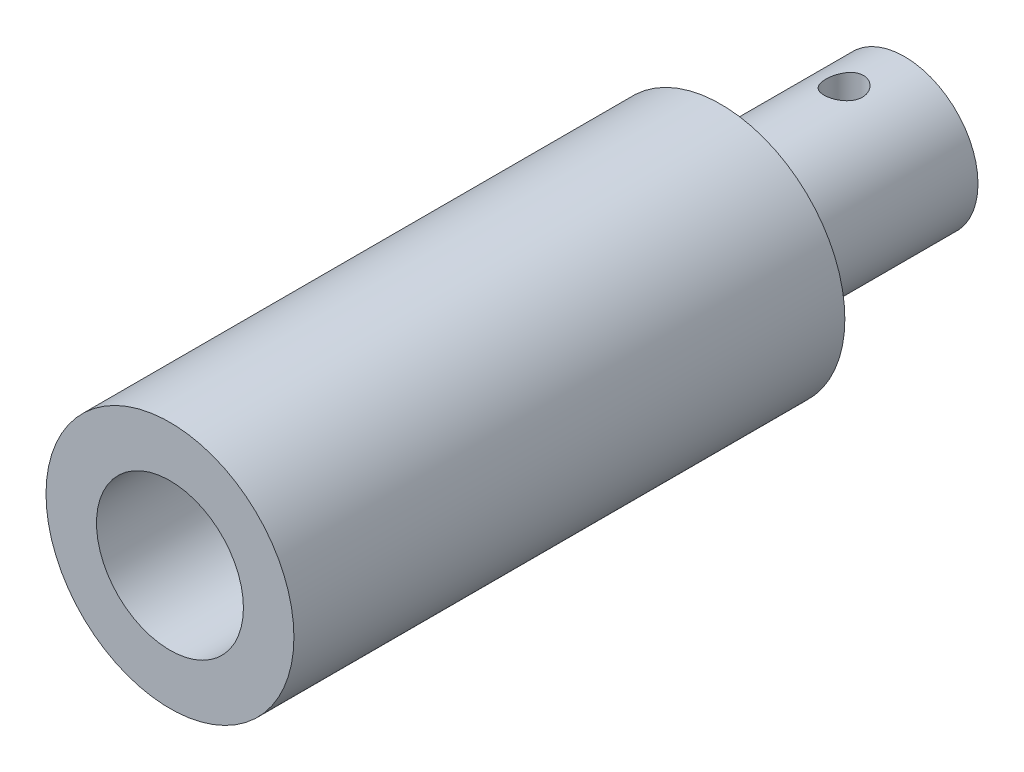
ISO-10303-21;
HEADER;
FILE_DESCRIPTION(('STEP AP214'),'2;1');
FILE_NAME('part.step','',(''),(''),'','','');
FILE_SCHEMA(('AUTOMOTIVE_DESIGN { 1 0 10303 214 1 1 1 1 }'));
ENDSEC;
DATA;
#1=APPLICATION_CONTEXT('core data for automotive mechanical design processes');
#2=APPLICATION_PROTOCOL_DEFINITION('international standard','automotive_design',2000,#1);
#3=PRODUCT_CONTEXT('',#1,'mechanical');
#4=PRODUCT('Part','Part','',(#3));
#5=PRODUCT_RELATED_PRODUCT_CATEGORY('part','',(#4));
#6=PRODUCT_DEFINITION_FORMATION('','',#4);
#7=PRODUCT_DEFINITION_CONTEXT('part definition',#1,'design');
#8=PRODUCT_DEFINITION('design','',#6,#7);
#9=PRODUCT_DEFINITION_SHAPE('','',#8);
#10=(LENGTH_UNIT() NAMED_UNIT(*) SI_UNIT(.MILLI.,.METRE.));
#11=(NAMED_UNIT(*) PLANE_ANGLE_UNIT() SI_UNIT($,.RADIAN.));
#12=(NAMED_UNIT(*) SI_UNIT($,.STERADIAN.) SOLID_ANGLE_UNIT());
#13=UNCERTAINTY_MEASURE_WITH_UNIT(LENGTH_MEASURE(1.E-05),#10,'distance_accuracy_value','');
#14=(GEOMETRIC_REPRESENTATION_CONTEXT(3) GLOBAL_UNCERTAINTY_ASSIGNED_CONTEXT((#13)) GLOBAL_UNIT_ASSIGNED_CONTEXT((#10,
#11,#12)) REPRESENTATION_CONTEXT('',''));
#15=CARTESIAN_POINT('',(0.,0.,0.));
#16=DIRECTION('',(0.,0.,1.));
#17=DIRECTION('',(1.,0.,0.));
#18=AXIS2_PLACEMENT_3D('',#15,#16,#17);
#19=CARTESIAN_POINT('',(0.,0.,30.));
#20=DIRECTION('',(0.,0.,-1.));
#21=DIRECTION('',(-1.,0.,0.));
#22=AXIS2_PLACEMENT_3D('',#19,#20,#21);
#23=CYLINDRICAL_SURFACE('',#22,6.75);
#24=CARTESIAN_POINT('',(0.,0.,30.));
#25=DIRECTION('',(0.,0.,1.));
#26=DIRECTION('',(1.,0.,0.));
#27=AXIS2_PLACEMENT_3D('',#24,#25,#26);
#28=CIRCLE('',#27,6.75);
#29=CARTESIAN_POINT('',(6.75,0.,30.));
#30=VERTEX_POINT('',#29);
#31=EDGE_CURVE('E45',#30,#30,#28,.T.);
#32=ORIENTED_EDGE('',*,*,#31,.F.);
#33=EDGE_LOOP('',(#32));
#34=FACE_BOUND('',#33,.T.);
#35=CARTESIAN_POINT('',(0.,0.,0.));
#36=DIRECTION('',(0.,0.,1.));
#37=DIRECTION('',(1.,0.,0.));
#38=AXIS2_PLACEMENT_3D('',#35,#36,#37);
#39=CIRCLE('',#38,6.75);
#40=CARTESIAN_POINT('',(6.75,0.,0.));
#41=VERTEX_POINT('',#40);
#42=EDGE_CURVE('E83',#41,#41,#39,.T.);
#43=ORIENTED_EDGE('',*,*,#42,.T.);
#44=EDGE_LOOP('',(#43));
#45=FACE_BOUND('',#44,.T.);
#46=ADVANCED_FACE('F30',(#34,#45),#23,.T.);
#47=CARTESIAN_POINT('',(0.,0.,30.));
#48=DIRECTION('',(0.,0.,1.));
#49=DIRECTION('',(1.,0.,0.));
#50=AXIS2_PLACEMENT_3D('',#47,#48,#49);
#51=PLANE('',#50);
#52=CARTESIAN_POINT('',(0.,0.,30.));
#53=DIRECTION('',(0.,0.,1.));
#54=DIRECTION('',(1.,0.,0.));
#55=AXIS2_PLACEMENT_3D('',#52,#53,#54);
#56=CIRCLE('',#55,4.);
#57=CARTESIAN_POINT('',(4.,0.,30.));
#58=VERTEX_POINT('',#57);
#59=EDGE_CURVE('E89',#58,#58,#56,.T.);
#60=ORIENTED_EDGE('',*,*,#59,.F.);
#61=EDGE_LOOP('',(#60));
#62=FACE_BOUND('',#61,.T.);
#63=ORIENTED_EDGE('',*,*,#31,.T.);
#64=EDGE_LOOP('',(#63));
#65=FACE_BOUND('',#64,.T.);
#66=ADVANCED_FACE('F72',(#62,#65),#51,.T.);
#67=CARTESIAN_POINT('',(0.,0.,0.));
#68=DIRECTION('',(0.,0.,1.));
#69=DIRECTION('',(1.,0.,0.));
#70=AXIS2_PLACEMENT_3D('',#67,#68,#69);
#71=PLANE('',#70);
#72=CARTESIAN_POINT('',(0.,0.,0.));
#73=DIRECTION('',(0.,0.,1.));
#74=DIRECTION('',(1.,0.,0.));
#75=AXIS2_PLACEMENT_3D('',#72,#73,#74);
#76=CIRCLE('',#75,4.);
#77=CARTESIAN_POINT('',(4.,0.,0.));
#78=VERTEX_POINT('',#77);
#79=EDGE_CURVE('E41',#78,#78,#76,.F.);
#80=ORIENTED_EDGE('',*,*,#79,.F.);
#81=EDGE_LOOP('',(#80));
#82=FACE_BOUND('',#81,.T.);
#83=ORIENTED_EDGE('',*,*,#42,.F.);
#84=EDGE_LOOP('',(#83));
#85=FACE_BOUND('',#84,.T.);
#86=ADVANCED_FACE('F68',(#82,#85),#71,.F.);
#87=CARTESIAN_POINT('',(0.,0.,-10.));
#88=DIRECTION('',(0.,0.,1.));
#89=DIRECTION('',(1.,0.,0.));
#90=AXIS2_PLACEMENT_3D('',#87,#88,#89);
#91=CYLINDRICAL_SURFACE('',#90,4.);
#92=CARTESIAN_POINT('',(-0.291407976988012,-3.98937105205166,-6.));
#93=CARTESIAN_POINT('',(-0.236659502990925,-3.99336952482404,-6.0000012087546));
#94=CARTESIAN_POINT('',(-0.181814514888244,-3.99623247502533,-6.00451044360309));
#95=CARTESIAN_POINT('',(-0.0735237323927986,-3.99969163558865,-6.02248211776155));
#96=CARTESIAN_POINT('',(-0.020078467063883,-4.00028700079249,-6.03594789309375));
#97=CARTESIAN_POINT('',(0.0838273347416957,-3.99945900021631,-6.07144704172552));
#98=CARTESIAN_POINT('',(0.134289803624871,-3.998036956684,-6.09347479647431));
#99=CARTESIAN_POINT('',(0.230868267009241,-3.99362492206794,-6.14546153382399));
#100=CARTESIAN_POINT('',(0.276984073680137,-3.99063486326287,-6.17542085895527));
#101=CARTESIAN_POINT('',(0.364108938133832,-3.98363626504489,-6.24279306629894));
#102=CARTESIAN_POINT('',(0.405058249726416,-3.97961719777015,-6.28028207489967));
#103=CARTESIAN_POINT('',(0.480190952113112,-3.97125280824271,-6.36148941030177));
#104=CARTESIAN_POINT('',(0.514373639222051,-3.96690745212283,-6.405208384167));
#105=CARTESIAN_POINT('',(0.575610307100303,-3.95849067149423,-6.49855192455116));
#106=CARTESIAN_POINT('',(0.602524986065113,-3.95442558101153,-6.54826858009401));
#107=CARTESIAN_POINT('',(0.647624425271994,-3.94729109659302,-6.65158270272288));
#108=CARTESIAN_POINT('',(0.665809624990428,-3.94422165253497,-6.70517997428705));
#109=CARTESIAN_POINT('',(0.692828738256708,-3.93956562149176,-6.81445014336415));
#110=CARTESIAN_POINT('',(0.701710865448372,-3.93797139418715,-6.87011077573539));
#111=CARTESIAN_POINT('',(0.710009243001999,-3.93648391052983,-6.98215332553855));
#112=CARTESIAN_POINT('',(0.709426342846812,-3.93659050152928,-7.03853517778741));
#113=CARTESIAN_POINT('',(0.698887574861619,-3.93847470161738,-7.14962003849175));
#114=CARTESIAN_POINT('',(0.689057375353808,-3.9402299060056,-7.20433541891825));
#115=CARTESIAN_POINT('',(0.660505870128093,-3.94511593624455,-7.31132981119758));
#116=CARTESIAN_POINT('',(0.641784092864533,-3.9482468350516,-7.36360869367452));
#117=CARTESIAN_POINT('',(0.595869708061818,-3.95543667669708,-7.46457604701986));
#118=CARTESIAN_POINT('',(0.568631684978786,-3.95950056335838,-7.51324349512801));
#119=CARTESIAN_POINT('',(0.506473218755464,-3.96792962850571,-7.60537101831155));
#120=CARTESIAN_POINT('',(0.471552000686531,-3.97229483735267,-7.64883056743372));
#121=CARTESIAN_POINT('',(0.394434162364099,-3.98069630733212,-7.72992720345238));
#122=CARTESIAN_POINT('',(0.352144583458748,-3.9847272539285,-7.76747654322615));
#123=CARTESIAN_POINT('',(0.261787687367046,-3.99168090817694,-7.83495713293552));
#124=CARTESIAN_POINT('',(0.213720691376022,-3.99460367740057,-7.86488880608691));
#125=CARTESIAN_POINT('',(0.113514251855234,-3.99870086174475,-7.91606810613668));
#126=CARTESIAN_POINT('',(0.0614053638246037,-3.99988726161215,-7.9373745196767));
#127=CARTESIAN_POINT('',(-0.0456476240306209,-4.00009721934816,-7.97095185006928));
#128=CARTESIAN_POINT('',(-0.100591257542195,-3.999121131843,-7.98322424797007));
#129=CARTESIAN_POINT('',(-0.21048875496413,-3.994828491793,-7.99823000312651));
#130=CARTESIAN_POINT('',(-0.265417944883341,-3.99156175422357,-8.00115915746385));
#131=CARTESIAN_POINT('',(-0.374832517690594,-3.98277704878563,-7.9980159917544));
#132=CARTESIAN_POINT('',(-0.429317902085405,-3.97725908856353,-7.99194370228134));
#133=CARTESIAN_POINT('',(-0.536358945624589,-3.96424380621617,-7.97106866067505));
#134=CARTESIAN_POINT('',(-0.588913823752245,-3.95674569281972,-7.95626241552001));
#135=CARTESIAN_POINT('',(-0.690720977856095,-3.94024960766083,-7.9184224897618));
#136=CARTESIAN_POINT('',(-0.739972679036249,-3.93125137580283,-7.89538738161801));
#137=CARTESIAN_POINT('',(-0.835437030796865,-3.91209526568919,-7.84091916747281));
#138=CARTESIAN_POINT('',(-0.881508612651438,-3.90191013246969,-7.80924840154173));
#139=CARTESIAN_POINT('',(-0.967739866292073,-3.8814233477806,-7.73870142329045));
#140=CARTESIAN_POINT('',(-1.00789824962826,-3.87112167144199,-7.69982364476262));
#141=CARTESIAN_POINT('',(-1.08218632577817,-3.85102488840485,-7.6147649539795));
#142=CARTESIAN_POINT('',(-1.11614110096925,-3.84124877032179,-7.56842636206939));
#143=CARTESIAN_POINT('',(-1.17573702885848,-3.82342960768039,-7.47037413829197));
#144=CARTESIAN_POINT('',(-1.20137946419167,-3.81538629580581,-7.41866133731943));
#145=CARTESIAN_POINT('',(-1.24300445354761,-3.802027133648,-7.31247911653609));
#146=CARTESIAN_POINT('',(-1.25918766448115,-3.79665501903442,-7.25809569627776));
#147=CARTESIAN_POINT('',(-1.28213710678233,-3.78896746213137,-7.14717361504521));
#148=CARTESIAN_POINT('',(-1.28890687588924,-3.78665087153834,-7.0906357719532));
#149=CARTESIAN_POINT('',(-1.29266555975555,-3.78536893329564,-6.97993216547664));
#150=CARTESIAN_POINT('',(-1.29010937082872,-3.78624771634105,-6.9257831451181));
#151=CARTESIAN_POINT('',(-1.27632168735428,-3.79091742883847,-6.81873472558683));
#152=CARTESIAN_POINT('',(-1.26509046683559,-3.79470826630379,-6.76583528699642));
#153=CARTESIAN_POINT('',(-1.23450144485036,-3.80476805465807,-6.66322676671069));
#154=CARTESIAN_POINT('',(-1.21521773282852,-3.81101438309016,-6.6134932457791));
#155=CARTESIAN_POINT('',(-1.16914712688934,-3.8253986634355,-6.5179323240415));
#156=CARTESIAN_POINT('',(-1.14235881523297,-3.83353697272476,-6.4721056634397));
#157=CARTESIAN_POINT('',(-1.08076067770633,-3.85136648761975,-6.38360017984785));
#158=CARTESIAN_POINT('',(-1.04566360825517,-3.86110819587419,-6.34113150140303));
#159=CARTESIAN_POINT('',(-0.969045005683759,-3.88104584544016,-6.26255785578672));
#160=CARTESIAN_POINT('',(-0.927521275925685,-3.89124194121006,-6.22645507354387));
#161=CARTESIAN_POINT('',(-0.837361077405693,-3.91165451382749,-6.16024910064354));
#162=CARTESIAN_POINT('',(-0.788512805844275,-3.92185675742539,-6.13042931290753));
#163=CARTESIAN_POINT('',(-0.68627014253755,-3.94103172360693,-6.07948831891673));
#164=CARTESIAN_POINT('',(-0.632878415355042,-3.95000515889134,-6.05836205609482));
#165=CARTESIAN_POINT('',(-0.531713896491235,-3.96477848537321,-6.02810256648837));
#166=CARTESIAN_POINT('',(-0.484386534606076,-3.97085579421453,-6.01760167045038));
#167=CARTESIAN_POINT('',(-0.388534010996918,-3.9813772079953,-6.00355035000855));
#168=CARTESIAN_POINT('',(-0.340009022385988,-3.98582154751673,-5.99999892697032));
#169=CARTESIAN_POINT('',(-0.291407976988012,-3.98937105205166,-6.));
#170=B_SPLINE_CURVE_WITH_KNOTS('',3,(#92,#93,#94,#95,#96,#97,#98,#99,#100,#101,#102,#103,#104,
#105,#106,#107,#108,#109,#110,#111,#112,#113,#114,#115,#116,#117,#118,#119,#120,#121,#122,#123,
#124,#125,#126,#127,#128,#129,#130,#131,#132,#133,#134,#135,#136,#137,#138,#139,#140,#141,#142,
#143,#144,#145,#146,#147,#148,#149,#150,#151,#152,#153,#154,#155,#156,#157,#158,#159,#160,#161,
#162,#163,#164,#165,#166,#167,#168,#169),.UNSPECIFIED.,.T.,.F.,(4,2,2,2,2,2,2,2,2,2,2,2,2,2,2,2,
2,2,2,2,2,2,2,2,2,2,2,2,2,2,2,2,2,2,2,2,2,2,4),(0.,0.164508397904642,0.32907810421587,
0.493539998258919,0.65800899586248,0.824233065221205,0.99047441173719,1.1597063105851,
1.328929688739,1.49727165203164,1.66559850677625,1.83167039322494,1.99775108792168,
2.16473301713238,2.33173179590214,2.5010142298937,2.67028725698281,2.83838632810505,
3.00645783470635,3.17098327251382,3.33550815150586,3.50009887454586,3.66471816461075,
3.83442787188016,4.00417450331186,4.17814580934405,4.35209025795328,4.52219670360169,
4.69223920292098,4.85410079872449,5.01595728181504,5.1763562697533,5.33678558008672,
5.50388618454175,5.67104403077343,5.84461660072319,6.01808806942982,6.1641456432174,
6.31018222709254),.UNSPECIFIED.);
#171=CARTESIAN_POINT('',(-0.291407976988012,-3.98937105205166,-6.));
#172=VERTEX_POINT('',#171);
#173=EDGE_CURVE('E33',#172,#172,#170,.T.);
#174=ORIENTED_EDGE('',*,*,#173,.T.);
#175=EDGE_LOOP('',(#174));
#176=FACE_BOUND('',#175,.T.);
#177=CARTESIAN_POINT('',(-0.291407976988012,3.98937105205166,-6.));
#178=CARTESIAN_POINT('',(-0.347364582567642,3.98528246422737,-6.00000184831447));
#179=CARTESIAN_POINT('',(-0.403255677944195,3.98000529654282,-6.0047129225461));
#180=CARTESIAN_POINT('',(-0.513259817397566,3.96732125759901,-6.02332241680188));
#181=CARTESIAN_POINT('',(-0.567371469750422,3.95991276156437,-6.03722785650589));
#182=CARTESIAN_POINT('',(-0.672223488348868,3.94346653739398,-6.07368735221453));
#183=CARTESIAN_POINT('',(-0.722969341034566,3.93443155452411,-6.09622690634218));
#184=CARTESIAN_POINT('',(-0.819902535351051,3.91538031412648,-6.1492667169483));
#185=CARTESIAN_POINT('',(-0.866089776771795,3.90536403503694,-6.17976714837372));
#186=CARTESIAN_POINT('',(-0.953880556620722,3.88486762621934,-6.24878417475959));
#187=CARTESIAN_POINT('',(-0.995339787776532,3.87438216509278,-6.28748290816697));
#188=CARTESIAN_POINT('',(-1.0712139584707,3.85409476215357,-6.37142717545345));
#189=CARTESIAN_POINT('',(-1.10562813852611,3.84429289410983,-6.41667341428171));
#190=CARTESIAN_POINT('',(-1.16662223057557,3.82622718942746,-6.51290074145794));
#191=CARTESIAN_POINT('',(-1.19314802768847,3.81797411379168,-6.56391827191433));
#192=CARTESIAN_POINT('',(-1.23714539356064,3.80394650316018,-6.6700353784521));
#193=CARTESIAN_POINT('',(-1.25462002110633,3.79817113095346,-6.72513356829589));
#194=CARTESIAN_POINT('',(-1.27932578909916,3.78991945950932,-6.83543743304127));
#195=CARTESIAN_POINT('',(-1.28694726595746,3.78731769381696,-6.89054622358515));
#196=CARTESIAN_POINT('',(-1.29294314855441,3.78527535436308,-7.0013168265736));
#197=CARTESIAN_POINT('',(-1.29131983216975,3.78583400188932,-7.05697849941648));
#198=CARTESIAN_POINT('',(-1.27913262666363,3.78996789902849,-7.16506947287624));
#199=CARTESIAN_POINT('',(-1.26890601795503,3.79342933288962,-7.21754174164733));
#200=CARTESIAN_POINT('',(-1.24032350444282,3.80287024056539,-7.31998106118818));
#201=CARTESIAN_POINT('',(-1.22196680245049,3.80884996130549,-7.36994786575199));
#202=CARTESIAN_POINT('',(-1.17732921176079,3.82288501167571,-7.46695180258257));
#203=CARTESIAN_POINT('',(-1.15091652117106,3.83097451284983,-7.51392316432626));
#204=CARTESIAN_POINT('',(-1.09104751483683,3.84845237076149,-7.60287030034481));
#205=CARTESIAN_POINT('',(-1.05758941295244,3.85784105665867,-7.64484480359313));
#206=CARTESIAN_POINT('',(-0.982709464226124,3.87760873614493,-7.72473545574491));
#207=CARTESIAN_POINT('',(-0.940981728355101,3.88801364619462,-7.76235887218085));
#208=CARTESIAN_POINT('',(-0.851774540825906,3.90852564754384,-7.8301374178726));
#209=CARTESIAN_POINT('',(-0.804294255957963,3.91863269543625,-7.86029146332067));
#210=CARTESIAN_POINT('',(-0.703822585620737,3.93793044484704,-7.912790418073));
#211=CARTESIAN_POINT('',(-0.650743590210665,3.94710007331065,-7.93497597295194));
#212=CARTESIAN_POINT('',(-0.541307587255579,3.96358978233818,-7.96997348651912));
#213=CARTESIAN_POINT('',(-0.484951206404554,3.97091021507971,-7.9827872309424));
#214=CARTESIAN_POINT('',(-0.372135941487761,3.98304502366319,-7.99831792722219));
#215=CARTESIAN_POINT('',(-0.315719284723496,3.98792062444766,-8.00129324648089));
#216=CARTESIAN_POINT('',(-0.203037638126331,3.99524236121068,-7.99768060053553));
#217=CARTESIAN_POINT('',(-0.14677262264616,3.99768893757339,-7.99109436938188));
#218=CARTESIAN_POINT('',(-0.0377328317165003,4.00018328772689,-7.96884220981637));
#219=CARTESIAN_POINT('',(0.0150958811331807,4.00029897870371,-7.95344684888885));
#220=CARTESIAN_POINT('',(0.117489526371001,3.99860226524974,-7.91422573804918));
#221=CARTESIAN_POINT('',(0.167054379684718,3.99678981412356,-7.89039978397578));
#222=CARTESIAN_POINT('',(0.261722120121783,3.99171134454909,-7.83490620242027));
#223=CARTESIAN_POINT('',(0.306809036750316,3.98844033683628,-7.80321182590385));
#224=CARTESIAN_POINT('',(0.391139490700559,3.9810557485365,-7.7329009119246));
#225=CARTESIAN_POINT('',(0.430382273627996,3.97694205933391,-7.69428348220986));
#226=CARTESIAN_POINT('',(0.502765842397861,3.96844876242607,-7.61026788720543));
#227=CARTESIAN_POINT('',(0.535759493022111,3.96406536450875,-7.56474323674847));
#228=CARTESIAN_POINT('',(0.593683080745488,3.95580581341088,-7.46878021928594));
#229=CARTESIAN_POINT('',(0.618612865529182,3.9519296698125,-7.41834175948862));
#230=CARTESIAN_POINT('',(0.659785896826653,3.94526582226629,-7.31369638101157));
#231=CARTESIAN_POINT('',(0.675989148815524,3.94248314524962,-7.25947337687947));
#232=CARTESIAN_POINT('',(0.699033905337236,3.93846296605077,-7.14901948524067));
#233=CARTESIAN_POINT('',(0.705876425950517,3.93722529616379,-7.09278881634023));
#234=CARTESIAN_POINT('',(0.709954563113922,3.93649190838311,-6.98077089414936));
#235=CARTESIAN_POINT('',(0.707325206300695,3.93697170645195,-6.92498868127863));
#236=CARTESIAN_POINT('',(0.692842679568882,3.9395459187075,-6.81467482317477));
#237=CARTESIAN_POINT('',(0.680989542172779,3.9416403272012,-6.76014317353295));
#238=CARTESIAN_POINT('',(0.648474996294577,3.9471190213989,-6.65403829943333));
#239=CARTESIAN_POINT('',(0.627841984005,3.95049914508847,-6.60245614047518));
#240=CARTESIAN_POINT('',(0.578365266892675,3.95804459384837,-6.50345439390653));
#241=CARTESIAN_POINT('',(0.549520835324011,3.96220998840753,-6.45603517522038));
#242=CARTESIAN_POINT('',(0.483944709764545,3.97075598242631,-6.36598574009766));
#243=CARTESIAN_POINT('',(0.447107313604364,3.97513879127634,-6.32343267209282));
#244=CARTESIAN_POINT('',(0.366786656062414,3.98335205845474,-6.2450641357508));
#245=CARTESIAN_POINT('',(0.32330243495305,3.98718243686283,-6.20924964205745));
#246=CARTESIAN_POINT('',(0.230723420749444,3.99361046604794,-6.14527451875161));
#247=CARTESIAN_POINT('',(0.181610217061495,3.99620391978614,-6.11714008466938));
#248=CARTESIAN_POINT('',(0.0793148223274259,3.99953983181223,-6.06954771307839));
#249=CARTESIAN_POINT('',(0.0261358884609707,4.0002837561251,-6.05008291365795));
#250=CARTESIAN_POINT('',(-0.0711365156242251,3.99959781580632,-6.02354843594715));
#251=CARTESIAN_POINT('',(-0.114763639416339,3.99859568925908,-6.01472508348684));
#252=CARTESIAN_POINT('',(-0.202743540271381,3.99510115205726,-6.00295020691342));
#253=CARTESIAN_POINT('',(-0.247096299205563,3.99260877857882,-5.9999985363316));
#254=CARTESIAN_POINT('',(-0.291407976988012,3.98937105205166,-6.));
#255=B_SPLINE_CURVE_WITH_KNOTS('',3,(#177,#178,#179,#180,#181,#182,#183,#184,#185,#186,#187,
#188,#189,#190,#191,#192,#193,#194,#195,#196,#197,#198,#199,#200,#201,#202,#203,#204,#205,#206,
#207,#208,#209,#210,#211,#212,#213,#214,#215,#216,#217,#218,#219,#220,#221,#222,#223,#224,#225,
#226,#227,#228,#229,#230,#231,#232,#233,#234,#235,#236,#237,#238,#239,#240,#241,#242,#243,#244,
#245,#246,#247,#248,#249,#250,#251,#252,#253,#254),.UNSPECIFIED.,.T.,.F.,(4,2,2,2,2,2,2,2,2,2,2,
2,2,2,2,2,2,2,2,2,2,2,2,2,2,2,2,2,2,2,2,2,2,2,2,2,2,2,4),(0.,0.168151384215313,
0.336431296488203,0.50442979604087,0.672431987812068,0.844654877378076,1.01689632345207,
1.19029345720516,1.36363195418028,1.52986891807512,1.69606492368011,1.85603360136331,
2.01601796809995,2.17877461771991,2.34157257889476,2.512209424146,2.68287101436512,
2.85677698956437,3.03064981951841,3.1999186961412,3.36915687856832,3.53345644183548,
3.69775998417001,3.86262992108079,4.02752112193469,4.19591089522996,4.36430384899278,
4.53346213424511,4.70260205639529,4.86934040144887,5.03607815859594,5.20228069680578,
5.36849794923048,5.53706418379643,5.7056547804829,5.87481342640754,6.04383794633625,
6.17699927290782,6.31015727773745),.UNSPECIFIED.);
#256=CARTESIAN_POINT('',(-0.291407976988012,3.98937105205166,-6.));
#257=VERTEX_POINT('',#256);
#258=EDGE_CURVE('E10',#257,#257,#255,.T.);
#259=ORIENTED_EDGE('',*,*,#258,.T.);
#260=EDGE_LOOP('',(#259));
#261=FACE_BOUND('',#260,.T.);
#262=CARTESIAN_POINT('',(0.,0.,-10.));
#263=DIRECTION('',(0.,0.,-1.));
#264=DIRECTION('',(-1.,0.,0.));
#265=AXIS2_PLACEMENT_3D('',#262,#263,#264);
#266=CIRCLE('',#265,4.);
#267=CARTESIAN_POINT('',(-4.,0.,-10.));
#268=VERTEX_POINT('',#267);
#269=EDGE_CURVE('E85',#268,#268,#266,.T.);
#270=ORIENTED_EDGE('',*,*,#269,.F.);
#271=EDGE_LOOP('',(#270));
#272=FACE_BOUND('',#271,.T.);
#273=ORIENTED_EDGE('',*,*,#79,.T.);
#274=EDGE_LOOP('',(#273));
#275=FACE_BOUND('',#274,.T.);
#276=ADVANCED_FACE('F50',(#176,#261,#272,#275),#91,.T.);
#277=CARTESIAN_POINT('',(0.,0.,-10.));
#278=DIRECTION('',(0.,0.,-1.));
#279=DIRECTION('',(-1.,0.,0.));
#280=AXIS2_PLACEMENT_3D('',#277,#278,#279);
#281=PLANE('',#280);
#282=ORIENTED_EDGE('',*,*,#269,.T.);
#283=EDGE_LOOP('',(#282));
#284=FACE_BOUND('',#283,.T.);
#285=ADVANCED_FACE('F59',(#284),#281,.T.);
#286=CARTESIAN_POINT('',(-0.291407976988012,-11.,-7.));
#287=DIRECTION('',(0.,1.,0.));
#288=DIRECTION('',(0.,0.,1.));
#289=AXIS2_PLACEMENT_3D('',#286,#287,#288);
#290=CYLINDRICAL_SURFACE('',#289,1.);
#291=ORIENTED_EDGE('',*,*,#258,.F.);
#292=EDGE_LOOP('',(#291));
#293=FACE_BOUND('',#292,.T.);
#294=ORIENTED_EDGE('',*,*,#173,.F.);
#295=EDGE_LOOP('',(#294));
#296=FACE_BOUND('',#295,.T.);
#297=ADVANCED_FACE('F54',(#293,#296),#290,.F.);
#298=CARTESIAN_POINT('',(0.,0.,5.));
#299=DIRECTION('',(0.,0.,1.));
#300=DIRECTION('',(1.,0.,0.));
#301=AXIS2_PLACEMENT_3D('',#298,#299,#300);
#302=CYLINDRICAL_SURFACE('',#301,4.);
#303=CARTESIAN_POINT('',(0.,0.,5.));
#304=DIRECTION('',(0.,0.,1.));
#305=DIRECTION('',(1.,0.,0.));
#306=AXIS2_PLACEMENT_3D('',#303,#304,#305);
#307=CIRCLE('',#306,4.);
#308=CARTESIAN_POINT('',(4.,0.,5.));
#309=VERTEX_POINT('',#308);
#310=EDGE_CURVE('E92',#309,#309,#307,.T.);
#311=ORIENTED_EDGE('',*,*,#310,.F.);
#312=EDGE_LOOP('',(#311));
#313=FACE_BOUND('',#312,.T.);
#314=ORIENTED_EDGE('',*,*,#59,.T.);
#315=EDGE_LOOP('',(#314));
#316=FACE_BOUND('',#315,.T.);
#317=ADVANCED_FACE('F58',(#313,#316),#302,.F.);
#318=CARTESIAN_POINT('',(0.,0.,5.));
#319=DIRECTION('',(0.,0.,1.));
#320=DIRECTION('',(1.,0.,0.));
#321=AXIS2_PLACEMENT_3D('',#318,#319,#320);
#322=PLANE('',#321);
#323=ORIENTED_EDGE('',*,*,#310,.T.);
#324=EDGE_LOOP('',(#323));
#325=FACE_BOUND('',#324,.T.);
#326=ADVANCED_FACE('F135',(#325),#322,.T.);
#327=CLOSED_SHELL('',(#46,#66,#86,#276,#285,#297,#317,#326));
#328=MANIFOLD_SOLID_BREP('B2',#327);
#329=ADVANCED_BREP_SHAPE_REPRESENTATION('',(#18,#328),#14);
#330=SHAPE_DEFINITION_REPRESENTATION(#9,#329);
ENDSEC;
END-ISO-10303-21;
